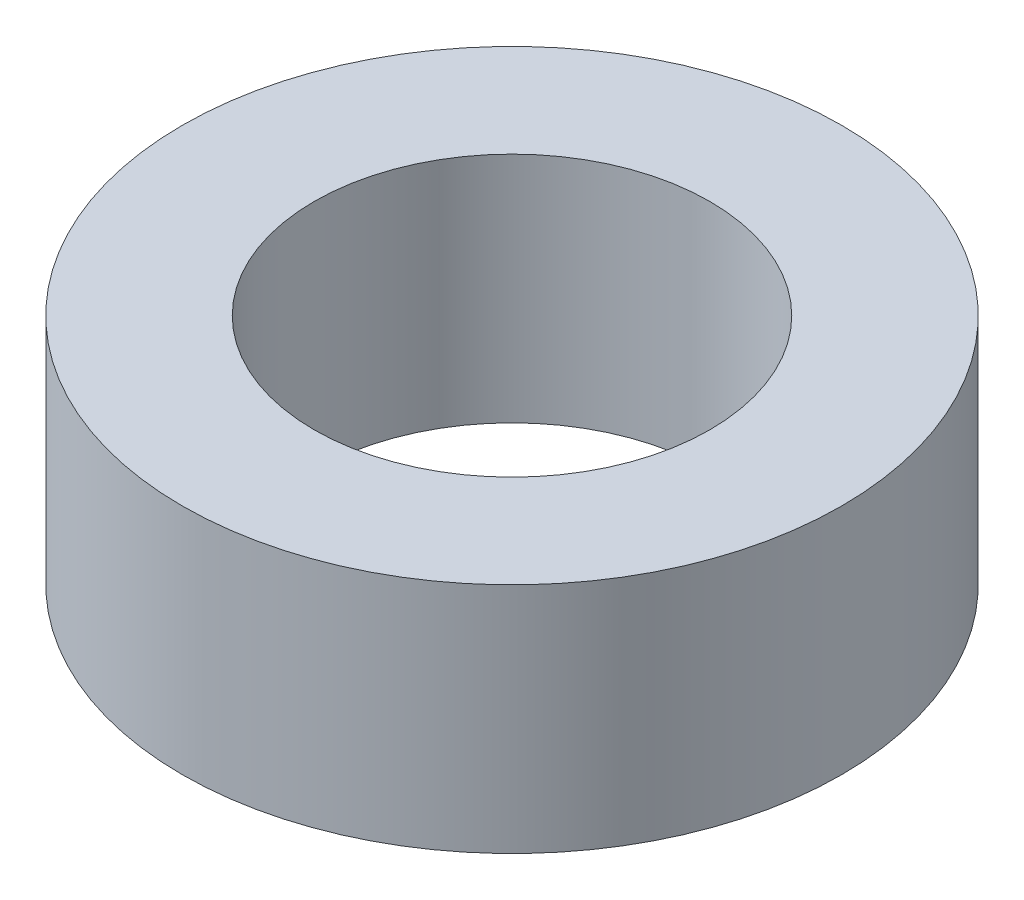
ISO-10303-21;
HEADER;
FILE_DESCRIPTION(('STEP AP214'),'2;1');
FILE_NAME('part.step','',(''),(''),'','','');
FILE_SCHEMA(('AUTOMOTIVE_DESIGN { 1 0 10303 214 1 1 1 1 }'));
ENDSEC;
DATA;
#1=APPLICATION_CONTEXT('core data for automotive mechanical design processes');
#2=APPLICATION_PROTOCOL_DEFINITION('international standard','automotive_design',2000,#1);
#3=PRODUCT_CONTEXT('',#1,'mechanical');
#4=PRODUCT('Part','Part','',(#3));
#5=PRODUCT_RELATED_PRODUCT_CATEGORY('part','',(#4));
#6=PRODUCT_DEFINITION_FORMATION('','',#4);
#7=PRODUCT_DEFINITION_CONTEXT('part definition',#1,'design');
#8=PRODUCT_DEFINITION('design','',#6,#7);
#9=PRODUCT_DEFINITION_SHAPE('','',#8);
#10=(LENGTH_UNIT() NAMED_UNIT(*) SI_UNIT(.MILLI.,.METRE.));
#11=(NAMED_UNIT(*) PLANE_ANGLE_UNIT() SI_UNIT($,.RADIAN.));
#12=(NAMED_UNIT(*) SI_UNIT($,.STERADIAN.) SOLID_ANGLE_UNIT());
#13=UNCERTAINTY_MEASURE_WITH_UNIT(LENGTH_MEASURE(1.E-05),#10,'distance_accuracy_value','');
#14=(GEOMETRIC_REPRESENTATION_CONTEXT(3) GLOBAL_UNCERTAINTY_ASSIGNED_CONTEXT((#13)) GLOBAL_UNIT_ASSIGNED_CONTEXT((#10,
#11,#12)) REPRESENTATION_CONTEXT('',''));
#15=CARTESIAN_POINT('',(0.,0.,0.));
#16=DIRECTION('',(0.,0.,1.));
#17=DIRECTION('',(1.,0.,0.));
#18=AXIS2_PLACEMENT_3D('',#15,#16,#17);
#19=CARTESIAN_POINT('',(0.,12.,0.));
#20=DIRECTION('',(0.,1.,0.));
#21=DIRECTION('',(0.,0.,1.));
#22=AXIS2_PLACEMENT_3D('',#19,#20,#21);
#23=PLANE('',#22);
#24=CARTESIAN_POINT('',(0.,12.,0.));
#25=DIRECTION('',(0.,1.,0.));
#26=DIRECTION('',(0.,0.,1.));
#27=AXIS2_PLACEMENT_3D('',#24,#25,#26);
#28=CIRCLE('',#27,17.);
#29=CARTESIAN_POINT('',(0.,12.,17.));
#30=VERTEX_POINT('',#29);
#31=EDGE_CURVE('E10',#30,#30,#28,.T.);
#32=ORIENTED_EDGE('',*,*,#31,.T.);
#33=EDGE_LOOP('',(#32));
#34=FACE_BOUND('',#33,.T.);
#35=CARTESIAN_POINT('',(0.,12.,0.));
#36=DIRECTION('',(0.,1.,0.));
#37=DIRECTION('',(0.,0.,1.));
#38=AXIS2_PLACEMENT_3D('',#35,#36,#37);
#39=CIRCLE('',#38,10.2);
#40=CARTESIAN_POINT('',(0.,12.,10.2));
#41=VERTEX_POINT('',#40);
#42=EDGE_CURVE('E48',#41,#41,#39,.T.);
#43=ORIENTED_EDGE('',*,*,#42,.F.);
#44=EDGE_LOOP('',(#43));
#45=FACE_BOUND('',#44,.T.);
#46=ADVANCED_FACE('F40',(#34,#45),#23,.T.);
#47=CARTESIAN_POINT('',(0.,0.,0.));
#48=DIRECTION('',(0.,1.,0.));
#49=DIRECTION('',(0.,0.,1.));
#50=AXIS2_PLACEMENT_3D('',#47,#48,#49);
#51=PLANE('',#50);
#52=CARTESIAN_POINT('',(0.,0.,0.));
#53=DIRECTION('',(0.,1.,0.));
#54=DIRECTION('',(0.,0.,1.));
#55=AXIS2_PLACEMENT_3D('',#52,#53,#54);
#56=CIRCLE('',#55,17.);
#57=CARTESIAN_POINT('',(0.,0.,17.));
#58=VERTEX_POINT('',#57);
#59=EDGE_CURVE('E41',#58,#58,#56,.T.);
#60=ORIENTED_EDGE('',*,*,#59,.F.);
#61=EDGE_LOOP('',(#60));
#62=FACE_BOUND('',#61,.T.);
#63=CARTESIAN_POINT('',(0.,0.,0.));
#64=DIRECTION('',(0.,1.,0.));
#65=DIRECTION('',(0.,0.,1.));
#66=AXIS2_PLACEMENT_3D('',#63,#64,#65);
#67=CIRCLE('',#66,10.2);
#68=CARTESIAN_POINT('',(0.,0.,10.2));
#69=VERTEX_POINT('',#68);
#70=EDGE_CURVE('E49',#69,#69,#67,.T.);
#71=ORIENTED_EDGE('',*,*,#70,.T.);
#72=EDGE_LOOP('',(#71));
#73=FACE_BOUND('',#72,.T.);
#74=ADVANCED_FACE('F58',(#62,#73),#51,.F.);
#75=CARTESIAN_POINT('',(0.,12.,0.));
#76=DIRECTION('',(0.,-1.,0.));
#77=DIRECTION('',(0.,0.,-1.));
#78=AXIS2_PLACEMENT_3D('',#75,#76,#77);
#79=CYLINDRICAL_SURFACE('',#78,17.);
#80=ORIENTED_EDGE('',*,*,#31,.F.);
#81=EDGE_LOOP('',(#80));
#82=FACE_BOUND('',#81,.T.);
#83=ORIENTED_EDGE('',*,*,#59,.T.);
#84=EDGE_LOOP('',(#83));
#85=FACE_BOUND('',#84,.T.);
#86=ADVANCED_FACE('F39',(#82,#85),#79,.T.);
#87=CARTESIAN_POINT('',(0.,12.,0.));
#88=DIRECTION('',(0.,-1.,0.));
#89=DIRECTION('',(0.,0.,-1.));
#90=AXIS2_PLACEMENT_3D('',#87,#88,#89);
#91=CYLINDRICAL_SURFACE('',#90,10.2);
#92=ORIENTED_EDGE('',*,*,#42,.T.);
#93=EDGE_LOOP('',(#92));
#94=FACE_BOUND('',#93,.T.);
#95=ORIENTED_EDGE('',*,*,#70,.F.);
#96=EDGE_LOOP('',(#95));
#97=FACE_BOUND('',#96,.T.);
#98=ADVANCED_FACE('F57',(#94,#97),#91,.F.);
#99=CLOSED_SHELL('',(#46,#74,#86,#98));
#100=MANIFOLD_SOLID_BREP('B2',#99);
#101=ADVANCED_BREP_SHAPE_REPRESENTATION('',(#18,#100),#14);
#102=SHAPE_DEFINITION_REPRESENTATION(#9,#101);
ENDSEC;
END-ISO-10303-21;
